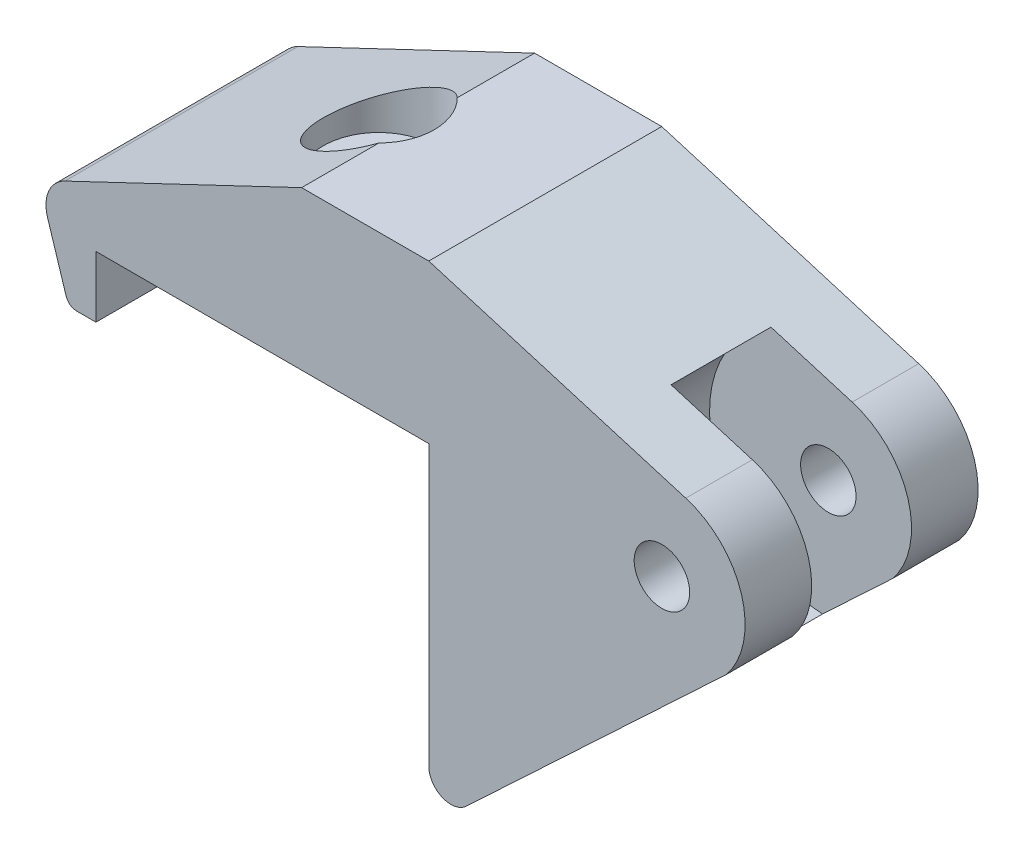
ISO-10303-21;
HEADER;
FILE_DESCRIPTION(('STEP AP214'),'2;1');
FILE_NAME('part.step','',(''),(''),'','','');
FILE_SCHEMA(('AUTOMOTIVE_DESIGN { 1 0 10303 214 1 1 1 1 }'));
ENDSEC;
DATA;
#1=APPLICATION_CONTEXT('core data for automotive mechanical design processes');
#2=APPLICATION_PROTOCOL_DEFINITION('international standard','automotive_design',2000,#1);
#3=PRODUCT_CONTEXT('',#1,'mechanical');
#4=PRODUCT('Part','Part','',(#3));
#5=PRODUCT_RELATED_PRODUCT_CATEGORY('part','',(#4));
#6=PRODUCT_DEFINITION_FORMATION('','',#4);
#7=PRODUCT_DEFINITION_CONTEXT('part definition',#1,'design');
#8=PRODUCT_DEFINITION('design','',#6,#7);
#9=PRODUCT_DEFINITION_SHAPE('','',#8);
#10=(LENGTH_UNIT() NAMED_UNIT(*) SI_UNIT(.MILLI.,.METRE.));
#11=(NAMED_UNIT(*) PLANE_ANGLE_UNIT() SI_UNIT($,.RADIAN.));
#12=(NAMED_UNIT(*) SI_UNIT($,.STERADIAN.) SOLID_ANGLE_UNIT());
#13=UNCERTAINTY_MEASURE_WITH_UNIT(LENGTH_MEASURE(1.E-05),#10,'distance_accuracy_value','');
#14=(GEOMETRIC_REPRESENTATION_CONTEXT(3) GLOBAL_UNCERTAINTY_ASSIGNED_CONTEXT((#13)) GLOBAL_UNIT_ASSIGNED_CONTEXT((#10,
#11,#12)) REPRESENTATION_CONTEXT('',''));
#15=CARTESIAN_POINT('',(0.,0.,0.));
#16=DIRECTION('',(0.,0.,1.));
#17=DIRECTION('',(1.,0.,0.));
#18=AXIS2_PLACEMENT_3D('',#15,#16,#17);
#19=CARTESIAN_POINT('',(-15.,36.251002769292,-4.5));
#20=DIRECTION('',(0.,-1.,0.));
#21=DIRECTION('',(1.,0.,0.));
#22=AXIS2_PLACEMENT_3D('',#19,#20,#21);
#23=CYLINDRICAL_SURFACE('',#22,5.);
#24=CARTESIAN_POINT('',(-15.,34.5660662940564,-4.5));
#25=DIRECTION('',(-0.429759506401997,0.902943390615996,0.));
#26=DIRECTION('',(-0.902943390615996,-0.429759506401997,0.));
#27=AXIS2_PLACEMENT_3D('',#24,#25,#26);
#28=ELLIPSE('',#27,5.53744570475116,5.);
#29=CARTESIAN_POINT('',(-11.4598752761535,36.251002769292,-8.03093711918105));
#30=VERTEX_POINT('',#29);
#31=CARTESIAN_POINT('',(-11.4598752761535,36.251002769292,-0.969062880818948));
#32=VERTEX_POINT('',#31);
#33=EDGE_CURVE('E254',#30,#32,#28,.T.);
#34=ORIENTED_EDGE('',*,*,#33,.T.);
#35=CARTESIAN_POINT('',(-15.,36.251002769292,-4.5));
#36=DIRECTION('',(0.,1.,0.));
#37=DIRECTION('',(0.,0.,1.));
#38=AXIS2_PLACEMENT_3D('',#35,#36,#37);
#39=CIRCLE('',#38,5.);
#40=EDGE_CURVE('E248',#32,#30,#39,.T.);
#41=ORIENTED_EDGE('',*,*,#40,.T.);
#42=EDGE_LOOP('',(#34,#41));
#43=FACE_BOUND('',#42,.T.);
#44=CARTESIAN_POINT('',(-15.,30.,-4.5));
#45=DIRECTION('',(0.,-1.,0.));
#46=DIRECTION('',(1.,0.,0.));
#47=AXIS2_PLACEMENT_3D('',#44,#45,#46);
#48=CIRCLE('',#47,5.);
#49=CARTESIAN_POINT('',(-10.,30.,-4.5));
#50=VERTEX_POINT('',#49);
#51=EDGE_CURVE('E12',#50,#50,#48,.F.);
#52=ORIENTED_EDGE('',*,*,#51,.F.);
#53=EDGE_LOOP('',(#52));
#54=FACE_BOUND('',#53,.T.);
#55=ADVANCED_FACE('F239',(#43,#54),#23,.F.);
#56=CARTESIAN_POINT('',(21.0164515512444,22.137322400844,-12.));
#57=DIRECTION('',(0.,0.,1.));
#58=DIRECTION('',(1.,0.,0.));
#59=AXIS2_PLACEMENT_3D('',#56,#57,#58);
#60=CYLINDRICAL_SURFACE('',#59,10.7077563901626);
#61=CARTESIAN_POINT('',(21.0164515512444,22.137322400844,-9.));
#62=DIRECTION('',(0.,0.,-1.));
#63=DIRECTION('',(-1.,0.,0.));
#64=AXIS2_PLACEMENT_3D('',#61,#62,#63);
#65=CIRCLE('',#64,10.7077563901626);
#66=CARTESIAN_POINT('',(15.8435034400864,31.512643982013,-9.));
#67=VERTEX_POINT('',#66);
#68=CARTESIAN_POINT('',(20.4941904225398,11.4423100013883,-9.));
#69=VERTEX_POINT('',#68);
#70=EDGE_CURVE('E262',#67,#69,#65,.F.);
#71=ORIENTED_EDGE('',*,*,#70,.F.);
#72=DIRECTION('',(0.,0.,1.));
#73=VECTOR('',#72,1.);
#74=CARTESIAN_POINT('',(15.8435034400864,31.512643982013,-12.));
#75=LINE('',#74,#73);
#76=CARTESIAN_POINT('',(15.8435034400864,31.512643982013,0.));
#77=VERTEX_POINT('',#76);
#78=EDGE_CURVE('E471',#67,#77,#75,.T.);
#79=ORIENTED_EDGE('',*,*,#78,.T.);
#80=CARTESIAN_POINT('',(21.0164515512444,22.137322400844,0.));
#81=DIRECTION('',(0.,0.,1.));
#82=DIRECTION('',(-1.,0.,0.));
#83=AXIS2_PLACEMENT_3D('',#80,#81,#82);
#84=CIRCLE('',#83,10.7077563901626);
#85=CARTESIAN_POINT('',(20.4941904225398,11.4423100013883,0.));
#86=VERTEX_POINT('',#85);
#87=EDGE_CURVE('E466',#77,#86,#84,.T.);
#88=ORIENTED_EDGE('',*,*,#87,.T.);
#89=DIRECTION('',(0.,0.,1.));
#90=VECTOR('',#89,1.);
#91=CARTESIAN_POINT('',(20.4941904225398,11.4423100013883,-12.));
#92=LINE('',#91,#90);
#93=EDGE_CURVE('E442',#69,#86,#92,.T.);
#94=ORIENTED_EDGE('',*,*,#93,.F.);
#95=EDGE_LOOP('',(#71,#79,#88,#94));
#96=FACE_BOUND('',#95,.T.);
#97=ADVANCED_FACE('F544',(#96),#60,.F.);
#98=CARTESIAN_POINT('',(-30.,16.4758973737552,-50.));
#99=DIRECTION('',(0.,-1.,0.));
#100=DIRECTION('',(0.,0.,-1.));
#101=AXIS2_PLACEMENT_3D('',#98,#99,#100);
#102=PLANE('',#101);
#103=DIRECTION('',(0.,0.,1.));
#104=VECTOR('',#103,1.);
#105=CARTESIAN_POINT('',(-30.,16.4758973737552,-50.));
#106=LINE('',#105,#104);
#107=CARTESIAN_POINT('',(-30.,16.4758973737552,-15.));
#108=VERTEX_POINT('',#107);
#109=CARTESIAN_POINT('',(-30.,16.4758973737552,6.));
#110=VERTEX_POINT('',#109);
#111=EDGE_CURVE('E397',#108,#110,#106,.T.);
#112=ORIENTED_EDGE('',*,*,#111,.T.);
#113=DIRECTION('',(1.,0.,0.));
#114=VECTOR('',#113,1.);
#115=CARTESIAN_POINT('',(-31.7352339741628,16.4758973737552,6.));
#116=LINE('',#115,#114);
#117=CARTESIAN_POINT('',(-31.7352339741628,16.4758973737552,6.));
#118=VERTEX_POINT('',#117);
#119=EDGE_CURVE('E513',#118,#110,#116,.T.);
#120=ORIENTED_EDGE('',*,*,#119,.F.);
#121=DIRECTION('',(0.,0.,1.));
#122=VECTOR('',#121,1.);
#123=CARTESIAN_POINT('',(-31.7352339741628,16.4758973737552,-50.));
#124=LINE('',#123,#122);
#125=CARTESIAN_POINT('',(-31.7352339741628,16.4758973737552,-15.));
#126=VERTEX_POINT('',#125);
#127=EDGE_CURVE('E423',#118,#126,#124,.F.);
#128=ORIENTED_EDGE('',*,*,#127,.T.);
#129=DIRECTION('',(-1.,0.,0.));
#130=VECTOR('',#129,1.);
#131=CARTESIAN_POINT('',(-30.,16.4758973737552,-15.));
#132=LINE('',#131,#130);
#133=EDGE_CURVE('E448',#108,#126,#132,.T.);
#134=ORIENTED_EDGE('',*,*,#133,.F.);
#135=EDGE_LOOP('',(#112,#120,#128,#134));
#136=FACE_BOUND('',#135,.T.);
#137=ADVANCED_FACE('F546',(#136),#102,.T.);
#138=CARTESIAN_POINT('',(-32.4681212818034,16.4758973737552,-50.));
#139=DIRECTION('',(-0.953582665134141,-0.301131367937098,0.));
#140=DIRECTION('',(0.301131367937098,-0.953582665134142,0.));
#141=AXIS2_PLACEMENT_3D('',#138,#139,#140);
#142=PLANE('',#141);
#143=DIRECTION('',(0.,0.,1.));
#144=VECTOR('',#143,1.);
#145=CARTESIAN_POINT('',(-32.6888166392969,17.1747660058181,-50.));
#146=LINE('',#145,#144);
#147=CARTESIAN_POINT('',(-32.6888166392969,17.1747660058181,-15.));
#148=VERTEX_POINT('',#147);
#149=CARTESIAN_POINT('',(-32.6888166392969,17.1747660058181,6.));
#150=VERTEX_POINT('',#149);
#151=EDGE_CURVE('E420',#148,#150,#146,.T.);
#152=ORIENTED_EDGE('',*,*,#151,.T.);
#153=DIRECTION('',(0.301131367937098,-0.953582665134141,0.));
#154=VECTOR('',#153,1.);
#155=CARTESIAN_POINT('',(-34.3656205008556,22.4846449007538,6.));
#156=LINE('',#155,#154);
#157=CARTESIAN_POINT('',(-34.3656205008556,22.4846449007538,6.));
#158=VERTEX_POINT('',#157);
#159=EDGE_CURVE('E506',#158,#150,#156,.T.);
#160=ORIENTED_EDGE('',*,*,#159,.F.);
#161=DIRECTION('',(0.,0.,1.));
#162=VECTOR('',#161,1.);
#163=CARTESIAN_POINT('',(-34.3656205008556,22.4846449007538,-50.));
#164=LINE('',#163,#162);
#165=CARTESIAN_POINT('',(-34.3656205008556,22.4846449007538,-15.));
#166=VERTEX_POINT('',#165);
#167=EDGE_CURVE('E417',#158,#166,#164,.F.);
#168=ORIENTED_EDGE('',*,*,#167,.T.);
#169=DIRECTION('',(-0.301131367937098,0.953582665134141,0.));
#170=VECTOR('',#169,1.);
#171=CARTESIAN_POINT('',(-32.6888166392969,17.1747660058181,-15.));
#172=LINE('',#171,#170);
#173=EDGE_CURVE('E616',#148,#166,#172,.T.);
#174=ORIENTED_EDGE('',*,*,#173,.F.);
#175=EDGE_LOOP('',(#152,#160,#168,#174));
#176=FACE_BOUND('',#175,.T.);
#177=ADVANCED_FACE('F552',(#176),#142,.T.);
#178=CARTESIAN_POINT('',(0.,22.,6.));
#179=DIRECTION('',(0.,1.,0.));
#180=DIRECTION('',(-1.,0.,0.));
#181=AXIS2_PLACEMENT_3D('',#178,#179,#180);
#182=PLANE('',#181);
#183=DIRECTION('',(0.,0.,-1.));
#184=VECTOR('',#183,1.);
#185=CARTESIAN_POINT('',(0.,22.,6.));
#186=LINE('',#185,#184);
#187=CARTESIAN_POINT('',(0.,22.,6.));
#188=VERTEX_POINT('',#187);
#189=CARTESIAN_POINT('',(0.,22.,-15.));
#190=VERTEX_POINT('',#189);
#191=EDGE_CURVE('E400',#188,#190,#186,.T.);
#192=ORIENTED_EDGE('',*,*,#191,.F.);
#193=DIRECTION('',(1.,0.,0.));
#194=VECTOR('',#193,1.);
#195=CARTESIAN_POINT('',(-30.,22.,6.));
#196=LINE('',#195,#194);
#197=CARTESIAN_POINT('',(-30.,22.,6.));
#198=VERTEX_POINT('',#197);
#199=EDGE_CURVE('E477',#198,#188,#196,.T.);
#200=ORIENTED_EDGE('',*,*,#199,.F.);
#201=DIRECTION('',(0.,0.,-1.));
#202=VECTOR('',#201,1.);
#203=CARTESIAN_POINT('',(-30.,22.,6.));
#204=LINE('',#203,#202);
#205=CARTESIAN_POINT('',(-30.,22.,-15.));
#206=VERTEX_POINT('',#205);
#207=EDGE_CURVE('E403',#198,#206,#204,.T.);
#208=ORIENTED_EDGE('',*,*,#207,.T.);
#209=DIRECTION('',(-1.,0.,0.));
#210=VECTOR('',#209,1.);
#211=CARTESIAN_POINT('',(0.,22.,-15.));
#212=LINE('',#211,#210);
#213=EDGE_CURVE('E644',#190,#206,#212,.T.);
#214=ORIENTED_EDGE('',*,*,#213,.F.);
#215=EDGE_LOOP('',(#192,#200,#208,#214));
#216=FACE_BOUND('',#215,.T.);
#217=CARTESIAN_POINT('',(-15.,22.,-4.5));
#218=DIRECTION('',(0.,-1.,0.));
#219=DIRECTION('',(1.,0.,0.));
#220=AXIS2_PLACEMENT_3D('',#217,#218,#219);
#221=CIRCLE('',#220,2.58274648517355);
#222=CARTESIAN_POINT('',(-12.4172535148265,22.,-4.5));
#223=VERTEX_POINT('',#222);
#224=EDGE_CURVE('E719',#223,#223,#221,.T.);
#225=ORIENTED_EDGE('',*,*,#224,.F.);
#226=EDGE_LOOP('',(#225));
#227=FACE_BOUND('',#226,.T.);
#228=ADVANCED_FACE('F584',(#216,#227),#182,.F.);
#229=CARTESIAN_POINT('',(-30.,22.,-50.));
#230=DIRECTION('',(1.,0.,0.));
#231=DIRECTION('',(0.,0.,-1.));
#232=AXIS2_PLACEMENT_3D('',#229,#230,#231);
#233=PLANE('',#232);
#234=DIRECTION('',(0.,-1.,0.));
#235=VECTOR('',#234,1.);
#236=CARTESIAN_POINT('',(-30.,22.,-15.));
#237=LINE('',#236,#235);
#238=EDGE_CURVE('E462',#206,#108,#237,.T.);
#239=ORIENTED_EDGE('',*,*,#238,.F.);
#240=ORIENTED_EDGE('',*,*,#207,.F.);
#241=DIRECTION('',(0.,1.,0.));
#242=VECTOR('',#241,1.);
#243=CARTESIAN_POINT('',(-30.,16.4758973737552,6.));
#244=LINE('',#243,#242);
#245=EDGE_CURVE('E474',#110,#198,#244,.T.);
#246=ORIENTED_EDGE('',*,*,#245,.F.);
#247=ORIENTED_EDGE('',*,*,#111,.F.);
#248=EDGE_LOOP('',(#239,#240,#246,#247));
#249=FACE_BOUND('',#248,.T.);
#250=ADVANCED_FACE('F582',(#249),#233,.T.);
#251=CARTESIAN_POINT('',(-35.1519436968129,24.9746683546187,-50.));
#252=DIRECTION('',(-0.429759506401997,0.902943390615996,0.));
#253=DIRECTION('',(-0.902943390615996,-0.429759506401997,0.));
#254=AXIS2_PLACEMENT_3D('',#251,#252,#253);
#255=PLANE('',#254);
#256=ORIENTED_EDGE('',*,*,#33,.F.);
#257=DIRECTION('',(0.,0.,1.));
#258=VECTOR('',#257,1.);
#259=CARTESIAN_POINT('',(-11.4598752761535,36.251002769292,-20.));
#260=LINE('',#259,#258);
#261=CARTESIAN_POINT('',(-11.4598752761535,36.251002769292,-15.));
#262=VERTEX_POINT('',#261);
#263=EDGE_CURVE('E371',#262,#30,#260,.T.);
#264=ORIENTED_EDGE('',*,*,#263,.F.);
#265=DIRECTION('',(0.902943390615997,0.429759506401997,0.));
#266=VECTOR('',#265,1.);
#267=CARTESIAN_POINT('',(-32.7941510246591,26.0968691764131,-15.));
#268=LINE('',#267,#266);
#269=CARTESIAN_POINT('',(-32.7941510246591,26.0968691764131,-15.));
#270=VERTEX_POINT('',#269);
#271=EDGE_CURVE('E615',#270,#262,#268,.T.);
#272=ORIENTED_EDGE('',*,*,#271,.F.);
#273=DIRECTION('',(0.,0.,1.));
#274=VECTOR('',#273,1.);
#275=CARTESIAN_POINT('',(-32.7941510246591,26.0968691764131,-50.));
#276=LINE('',#275,#274);
#277=CARTESIAN_POINT('',(-32.7941510246591,26.0968691764131,6.));
#278=VERTEX_POINT('',#277);
#279=EDGE_CURVE('E413',#270,#278,#276,.T.);
#280=ORIENTED_EDGE('',*,*,#279,.T.);
#281=DIRECTION('',(-0.902943390615997,-0.429759506401997,0.));
#282=VECTOR('',#281,1.);
#283=CARTESIAN_POINT('',(-11.4598752761535,36.251002769292,6.));
#284=LINE('',#283,#282);
#285=CARTESIAN_POINT('',(-11.4598752761535,36.251002769292,6.));
#286=VERTEX_POINT('',#285);
#287=EDGE_CURVE('E500',#286,#278,#284,.T.);
#288=ORIENTED_EDGE('',*,*,#287,.F.);
#289=EDGE_CURVE('E374',#32,#286,#260,.T.);
#290=ORIENTED_EDGE('',*,*,#289,.F.);
#291=EDGE_LOOP('',(#256,#264,#272,#280,#288,#290));
#292=FACE_BOUND('',#291,.T.);
#293=ADVANCED_FACE('F369',(#292),#255,.T.);
#294=CARTESIAN_POINT('',(-31.5048725054531,23.3880390045651,-50.));
#295=DIRECTION('',(0.,0.,1.));
#296=DIRECTION('',(1.,0.,0.));
#297=AXIS2_PLACEMENT_3D('',#294,#295,#296);
#298=CYLINDRICAL_SURFACE('',#297,3.);
#299=CARTESIAN_POINT('',(-31.5048725054531,23.3880390045651,-15.));
#300=DIRECTION('',(0.,0.,-1.));
#301=DIRECTION('',(-1.,0.,0.));
#302=AXIS2_PLACEMENT_3D('',#299,#300,#301);
#303=CIRCLE('',#302,3.);
#304=EDGE_CURVE('E610',#166,#270,#303,.T.);
#305=ORIENTED_EDGE('',*,*,#304,.F.);
#306=ORIENTED_EDGE('',*,*,#167,.F.);
#307=CARTESIAN_POINT('',(-31.5048725054531,23.3880390045651,6.));
#308=DIRECTION('',(0.,0.,1.));
#309=DIRECTION('',(1.,0.,0.));
#310=AXIS2_PLACEMENT_3D('',#307,#308,#309);
#311=CIRCLE('',#310,3.);
#312=EDGE_CURVE('E503',#278,#158,#311,.T.);
#313=ORIENTED_EDGE('',*,*,#312,.F.);
#314=ORIENTED_EDGE('',*,*,#279,.F.);
#315=EDGE_LOOP('',(#305,#306,#313,#314));
#316=FACE_BOUND('',#315,.T.);
#317=ADVANCED_FACE('F592',(#316),#298,.T.);
#318=CARTESIAN_POINT('',(-31.7352339741628,17.4758973737552,-50.));
#319=DIRECTION('',(0.,0.,1.));
#320=DIRECTION('',(1.,0.,0.));
#321=AXIS2_PLACEMENT_3D('',#318,#319,#320);
#322=CYLINDRICAL_SURFACE('',#321,1.);
#323=CARTESIAN_POINT('',(-31.7352339741628,17.4758973737552,-15.));
#324=DIRECTION('',(0.,0.,-1.));
#325=DIRECTION('',(-1.,0.,0.));
#326=AXIS2_PLACEMENT_3D('',#323,#324,#325);
#327=CIRCLE('',#326,1.);
#328=EDGE_CURVE('E454',#126,#148,#327,.T.);
#329=ORIENTED_EDGE('',*,*,#328,.F.);
#330=ORIENTED_EDGE('',*,*,#127,.F.);
#331=CARTESIAN_POINT('',(-31.7352339741628,17.4758973737552,6.));
#332=DIRECTION('',(0.,0.,1.));
#333=DIRECTION('',(1.,0.,0.));
#334=AXIS2_PLACEMENT_3D('',#331,#332,#333);
#335=CIRCLE('',#334,1.);
#336=EDGE_CURVE('E510',#150,#118,#335,.T.);
#337=ORIENTED_EDGE('',*,*,#336,.F.);
#338=ORIENTED_EDGE('',*,*,#151,.F.);
#339=EDGE_LOOP('',(#329,#330,#337,#338));
#340=FACE_BOUND('',#339,.T.);
#341=ADVANCED_FACE('F241',(#340),#322,.T.);
#342=CARTESIAN_POINT('',(9.95157109656071,33.2747598864639,12.));
#343=DIRECTION('',(0.286532687163959,0.958070466712444,0.));
#344=DIRECTION('',(-0.958070466712444,0.286532687163959,0.));
#345=AXIS2_PLACEMENT_3D('',#342,#343,#344);
#346=PLANE('',#345);
#347=DIRECTION('',(0.958070466712444,-0.286532687163959,0.));
#348=VECTOR('',#347,1.);
#349=CARTESIAN_POINT('',(0.,36.251002769292,-15.));
#350=LINE('',#349,#348);
#351=CARTESIAN_POINT('',(0.,36.251002769292,-15.));
#352=VERTEX_POINT('',#351);
#353=CARTESIAN_POINT('',(23.1654467049741,29.3228509011873,-15.));
#354=VERTEX_POINT('',#353);
#355=EDGE_CURVE('E626',#352,#354,#350,.T.);
#356=ORIENTED_EDGE('',*,*,#355,.F.);
#357=DIRECTION('',(0.,0.,-1.));
#358=VECTOR('',#357,1.);
#359=CARTESIAN_POINT('',(0.,36.251002769292,12.));
#360=LINE('',#359,#358);
#361=CARTESIAN_POINT('',(0.,36.251002769292,6.));
#362=VERTEX_POINT('',#361);
#363=EDGE_CURVE('E396',#362,#352,#360,.T.);
#364=ORIENTED_EDGE('',*,*,#363,.F.);
#365=DIRECTION('',(-0.958070466712444,0.286532687163959,0.));
#366=VECTOR('',#365,1.);
#367=CARTESIAN_POINT('',(23.1654467049741,29.3228509011873,6.));
#368=LINE('',#367,#366);
#369=CARTESIAN_POINT('',(23.1654467049741,29.3228509011873,6.));
#370=VERTEX_POINT('',#369);
#371=EDGE_CURVE('E493',#370,#362,#368,.T.);
#372=ORIENTED_EDGE('',*,*,#371,.F.);
#373=DIRECTION('',(0.,0.,-1.));
#374=VECTOR('',#373,1.);
#375=CARTESIAN_POINT('',(23.1654467049741,29.3228509011873,12.));
#376=LINE('',#375,#374);
#377=CARTESIAN_POINT('',(23.1654467049741,29.3228509011873,0.));
#378=VERTEX_POINT('',#377);
#379=EDGE_CURVE('E383',#370,#378,#376,.T.);
#380=ORIENTED_EDGE('',*,*,#379,.T.);
#381=DIRECTION('',(-0.958070466712444,0.286532687163959,0.));
#382=VECTOR('',#381,1.);
#383=CARTESIAN_POINT('',(9.95157109656071,33.2747598864639,0.));
#384=LINE('',#383,#382);
#385=EDGE_CURVE('E389',#378,#77,#384,.T.);
#386=ORIENTED_EDGE('',*,*,#385,.T.);
#387=ORIENTED_EDGE('',*,*,#78,.F.);
#388=DIRECTION('',(0.958070466712444,-0.286532687163959,0.));
#389=VECTOR('',#388,1.);
#390=CARTESIAN_POINT('',(0.,36.251002769292,-9.));
#391=LINE('',#390,#389);
#392=CARTESIAN_POINT('',(23.1654467049741,29.3228509011873,-9.));
#393=VERTEX_POINT('',#392);
#394=EDGE_CURVE('E438',#67,#393,#391,.T.);
#395=ORIENTED_EDGE('',*,*,#394,.T.);
#396=DIRECTION('',(0.,0.,1.));
#397=VECTOR('',#396,1.);
#398=CARTESIAN_POINT('',(23.1654467049741,29.3228509011873,-15.));
#399=LINE('',#398,#397);
#400=EDGE_CURVE('E461',#354,#393,#399,.T.);
#401=ORIENTED_EDGE('',*,*,#400,.F.);
#402=EDGE_LOOP('',(#356,#364,#372,#380,#386,#387,#395,#401));
#403=FACE_BOUND('',#402,.T.);
#404=ADVANCED_FACE('F538',(#403),#346,.T.);
#405=CARTESIAN_POINT('',(0.,0.,0.));
#406=DIRECTION('',(0.,0.,1.));
#407=DIRECTION('',(1.,0.,0.));
#408=AXIS2_PLACEMENT_3D('',#405,#406,#407);
#409=PLANE('',#408);
#410=CARTESIAN_POINT('',(21.0164515512444,22.137322400844,0.));
#411=DIRECTION('',(0.,0.,1.));
#412=DIRECTION('',(1.,0.,0.));
#413=AXIS2_PLACEMENT_3D('',#410,#411,#412);
#414=CIRCLE('',#413,2.5);
#415=CARTESIAN_POINT('',(23.5164515512444,22.137322400844,0.));
#416=VERTEX_POINT('',#415);
#417=EDGE_CURVE('E521',#416,#416,#414,.F.);
#418=ORIENTED_EDGE('',*,*,#417,.F.);
#419=EDGE_LOOP('',(#418));
#420=FACE_BOUND('',#419,.T.);
#421=ORIENTED_EDGE('',*,*,#87,.F.);
#422=ORIENTED_EDGE('',*,*,#385,.F.);
#423=CARTESIAN_POINT('',(21.0164515512444,22.137322400844,0.));
#424=DIRECTION('',(0.,0.,1.));
#425=DIRECTION('',(1.,0.,0.));
#426=AXIS2_PLACEMENT_3D('',#423,#424,#425);
#427=CIRCLE('',#426,7.50000000000001);
#428=CARTESIAN_POINT('',(26.7905466706926,17.3509014465646,0.));
#429=VERTEX_POINT('',#428);
#430=EDGE_CURVE('E527',#429,#378,#427,.T.);
#431=ORIENTED_EDGE('',*,*,#430,.F.);
#432=DIRECTION('',(0.72920441439023,0.684295931621547,0.));
#433=VECTOR('',#432,1.);
#434=CARTESIAN_POINT('',(3.88701176711011,-4.14210578842233,0.));
#435=LINE('',#434,#433);
#436=EDGE_CURVE('E525',#86,#429,#435,.T.);
#437=ORIENTED_EDGE('',*,*,#436,.F.);
#438=EDGE_LOOP('',(#421,#422,#431,#437));
#439=FACE_BOUND('',#438,.T.);
#440=ADVANCED_FACE('F542',(#420,#439),#409,.F.);
#441=CARTESIAN_POINT('',(2.,-3.17157287525383,6.));
#442=DIRECTION('',(0.,0.,-1.));
#443=DIRECTION('',(-1.,0.,0.));
#444=AXIS2_PLACEMENT_3D('',#441,#442,#443);
#445=CYLINDRICAL_SURFACE('',#444,2.);
#446=CARTESIAN_POINT('',(2.,-3.17157287525383,-15.));
#447=DIRECTION('',(0.,0.,-1.));
#448=DIRECTION('',(-1.,0.,0.));
#449=AXIS2_PLACEMENT_3D('',#446,#447,#448);
#450=CIRCLE('',#449,2.);
#451=CARTESIAN_POINT('',(3.41421356237313,-4.58578643762689,-15.));
#452=VERTEX_POINT('',#451);
#453=CARTESIAN_POINT('',(0.,-3.17157287525383,-15.));
#454=VERTEX_POINT('',#453);
#455=EDGE_CURVE('E636',#452,#454,#450,.T.);
#456=ORIENTED_EDGE('',*,*,#455,.F.);
#457=DIRECTION('',(0.,0.,-1.));
#458=VECTOR('',#457,1.);
#459=CARTESIAN_POINT('',(3.41421356237313,-4.58578643762689,6.));
#460=LINE('',#459,#458);
#461=CARTESIAN_POINT('',(3.41421356237313,-4.58578643762689,6.));
#462=VERTEX_POINT('',#461);
#463=EDGE_CURVE('E407',#462,#452,#460,.T.);
#464=ORIENTED_EDGE('',*,*,#463,.F.);
#465=CARTESIAN_POINT('',(2.,-3.17157287525383,6.));
#466=DIRECTION('',(0.,0.,1.));
#467=DIRECTION('',(1.,0.,0.));
#468=AXIS2_PLACEMENT_3D('',#465,#466,#467);
#469=CIRCLE('',#468,2.);
#470=CARTESIAN_POINT('',(0.,-3.17157287525383,6.));
#471=VERTEX_POINT('',#470);
#472=EDGE_CURVE('E483',#471,#462,#469,.T.);
#473=ORIENTED_EDGE('',*,*,#472,.F.);
#474=DIRECTION('',(0.,0.,-1.));
#475=VECTOR('',#474,1.);
#476=CARTESIAN_POINT('',(0.,-3.17157287525383,6.));
#477=LINE('',#476,#475);
#478=EDGE_CURVE('E410',#471,#454,#477,.T.);
#479=ORIENTED_EDGE('',*,*,#478,.T.);
#480=EDGE_LOOP('',(#456,#464,#473,#479));
#481=FACE_BOUND('',#480,.T.);
#482=ADVANCED_FACE('F567',(#481),#445,.T.);
#483=CARTESIAN_POINT('',(0.,0.,6.));
#484=DIRECTION('',(1.,0.,0.));
#485=DIRECTION('',(0.,1.,0.));
#486=AXIS2_PLACEMENT_3D('',#483,#484,#485);
#487=PLANE('',#486);
#488=ORIENTED_EDGE('',*,*,#191,.T.);
#489=DIRECTION('',(0.,1.,0.));
#490=VECTOR('',#489,1.);
#491=CARTESIAN_POINT('',(0.,-3.17157287525383,-15.));
#492=LINE('',#491,#490);
#493=EDGE_CURVE('E640',#454,#190,#492,.T.);
#494=ORIENTED_EDGE('',*,*,#493,.F.);
#495=ORIENTED_EDGE('',*,*,#478,.F.);
#496=DIRECTION('',(0.,-1.,0.));
#497=VECTOR('',#496,1.);
#498=CARTESIAN_POINT('',(0.,22.,6.));
#499=LINE('',#498,#497);
#500=EDGE_CURVE('E480',#188,#471,#499,.T.);
#501=ORIENTED_EDGE('',*,*,#500,.F.);
#502=EDGE_LOOP('',(#488,#494,#495,#501));
#503=FACE_BOUND('',#502,.T.);
#504=ADVANCED_FACE('F579',(#503),#487,.F.);
#505=CARTESIAN_POINT('',(0.,36.251002769292,12.));
#506=DIRECTION('',(0.,1.,0.));
#507=DIRECTION('',(0.,0.,1.));
#508=AXIS2_PLACEMENT_3D('',#505,#506,#507);
#509=PLANE('',#508);
#510=ORIENTED_EDGE('',*,*,#40,.F.);
#511=ORIENTED_EDGE('',*,*,#289,.T.);
#512=DIRECTION('',(-1.,0.,0.));
#513=VECTOR('',#512,1.);
#514=CARTESIAN_POINT('',(0.,36.251002769292,6.));
#515=LINE('',#514,#513);
#516=EDGE_CURVE('E496',#362,#286,#515,.T.);
#517=ORIENTED_EDGE('',*,*,#516,.F.);
#518=ORIENTED_EDGE('',*,*,#363,.T.);
#519=DIRECTION('',(1.,0.,0.));
#520=VECTOR('',#519,1.);
#521=CARTESIAN_POINT('',(-11.4598752761535,36.251002769292,-15.));
#522=LINE('',#521,#520);
#523=EDGE_CURVE('E381',#262,#352,#522,.T.);
#524=ORIENTED_EDGE('',*,*,#523,.F.);
#525=ORIENTED_EDGE('',*,*,#263,.T.);
#526=EDGE_LOOP('',(#510,#511,#517,#518,#524,#525));
#527=FACE_BOUND('',#526,.T.);
#528=ADVANCED_FACE('F379',(#527),#509,.T.);
#529=CARTESIAN_POINT('',(3.88701176711011,-4.14210578842233,12.));
#530=DIRECTION('',(-0.684295931621547,0.72920441439023,0.));
#531=DIRECTION('',(-0.72920441439023,-0.684295931621547,0.));
#532=AXIS2_PLACEMENT_3D('',#529,#530,#531);
#533=PLANE('',#532);
#534=DIRECTION('',(-0.72920441439023,-0.684295931621547,0.));
#535=VECTOR('',#534,1.);
#536=CARTESIAN_POINT('',(26.7905466706926,17.3509014465646,-9.));
#537=LINE('',#536,#535);
#538=CARTESIAN_POINT('',(26.7905466706926,17.3509014465646,-9.));
#539=VERTEX_POINT('',#538);
#540=EDGE_CURVE('E437',#539,#69,#537,.T.);
#541=ORIENTED_EDGE('',*,*,#540,.T.);
#542=ORIENTED_EDGE('',*,*,#93,.T.);
#543=ORIENTED_EDGE('',*,*,#436,.T.);
#544=DIRECTION('',(0.,0.,-1.));
#545=VECTOR('',#544,1.);
#546=CARTESIAN_POINT('',(26.7905466706926,17.3509014465646,12.));
#547=LINE('',#546,#545);
#548=CARTESIAN_POINT('',(26.7905466706926,17.3509014465646,6.));
#549=VERTEX_POINT('',#548);
#550=EDGE_CURVE('E387',#549,#429,#547,.T.);
#551=ORIENTED_EDGE('',*,*,#550,.F.);
#552=DIRECTION('',(0.72920441439023,0.684295931621547,0.));
#553=VECTOR('',#552,1.);
#554=CARTESIAN_POINT('',(3.41421356237313,-4.58578643762689,6.));
#555=LINE('',#554,#553);
#556=EDGE_CURVE('E487',#462,#549,#555,.T.);
#557=ORIENTED_EDGE('',*,*,#556,.F.);
#558=ORIENTED_EDGE('',*,*,#463,.T.);
#559=DIRECTION('',(-0.72920441439023,-0.684295931621547,0.));
#560=VECTOR('',#559,1.);
#561=CARTESIAN_POINT('',(26.7905466706926,17.3509014465646,-15.));
#562=LINE('',#561,#560);
#563=CARTESIAN_POINT('',(26.7905466706926,17.3509014465646,-15.));
#564=VERTEX_POINT('',#563);
#565=EDGE_CURVE('E632',#564,#452,#562,.T.);
#566=ORIENTED_EDGE('',*,*,#565,.F.);
#567=DIRECTION('',(0.,0.,1.));
#568=VECTOR('',#567,1.);
#569=CARTESIAN_POINT('',(26.7905466706926,17.3509014465646,-15.));
#570=LINE('',#569,#568);
#571=EDGE_CURVE('E446',#564,#539,#570,.T.);
#572=ORIENTED_EDGE('',*,*,#571,.T.);
#573=EDGE_LOOP('',(#541,#542,#543,#551,#557,#558,#566,#572));
#574=FACE_BOUND('',#573,.T.);
#575=ADVANCED_FACE('F441',(#574),#533,.F.);
#576=CARTESIAN_POINT('',(21.0164515512444,22.137322400844,12.));
#577=DIRECTION('',(0.,0.,-1.));
#578=DIRECTION('',(-1.,0.,0.));
#579=AXIS2_PLACEMENT_3D('',#576,#577,#578);
#580=CYLINDRICAL_SURFACE('',#579,2.5);
#581=ORIENTED_EDGE('',*,*,#417,.T.);
#582=EDGE_LOOP('',(#581));
#583=FACE_BOUND('',#582,.T.);
#584=CARTESIAN_POINT('',(21.0164515512444,22.137322400844,6.));
#585=DIRECTION('',(0.,0.,1.));
#586=DIRECTION('',(1.,0.,0.));
#587=AXIS2_PLACEMENT_3D('',#584,#585,#586);
#588=CIRCLE('',#587,2.5);
#589=CARTESIAN_POINT('',(23.5164515512444,22.137322400844,6.));
#590=VERTEX_POINT('',#589);
#591=EDGE_CURVE('E517',#590,#590,#588,.T.);
#592=ORIENTED_EDGE('',*,*,#591,.T.);
#593=EDGE_LOOP('',(#592));
#594=FACE_BOUND('',#593,.T.);
#595=ADVANCED_FACE('F569',(#583,#594),#580,.F.);
#596=CARTESIAN_POINT('',(21.0164515512444,22.137322400844,12.));
#597=DIRECTION('',(0.,0.,-1.));
#598=DIRECTION('',(-1.,0.,0.));
#599=AXIS2_PLACEMENT_3D('',#596,#597,#598);
#600=CYLINDRICAL_SURFACE('',#599,7.50000000000001);
#601=CARTESIAN_POINT('',(21.0164515512444,22.137322400844,6.));
#602=DIRECTION('',(0.,0.,1.));
#603=DIRECTION('',(1.,0.,0.));
#604=AXIS2_PLACEMENT_3D('',#601,#602,#603);
#605=CIRCLE('',#604,7.5);
#606=EDGE_CURVE('E490',#549,#370,#605,.T.);
#607=ORIENTED_EDGE('',*,*,#606,.F.);
#608=ORIENTED_EDGE('',*,*,#550,.T.);
#609=ORIENTED_EDGE('',*,*,#430,.T.);
#610=ORIENTED_EDGE('',*,*,#379,.F.);
#611=EDGE_LOOP('',(#607,#608,#609,#610));
#612=FACE_BOUND('',#611,.T.);
#613=ADVANCED_FACE('F563',(#612),#600,.T.);
#614=CARTESIAN_POINT('',(2.,-3.17157287525383,6.));
#615=DIRECTION('',(0.,0.,1.));
#616=DIRECTION('',(1.,0.,0.));
#617=AXIS2_PLACEMENT_3D('',#614,#615,#616);
#618=PLANE('',#617);
#619=ORIENTED_EDGE('',*,*,#516,.T.);
#620=ORIENTED_EDGE('',*,*,#287,.T.);
#621=ORIENTED_EDGE('',*,*,#312,.T.);
#622=ORIENTED_EDGE('',*,*,#159,.T.);
#623=ORIENTED_EDGE('',*,*,#336,.T.);
#624=ORIENTED_EDGE('',*,*,#119,.T.);
#625=ORIENTED_EDGE('',*,*,#245,.T.);
#626=ORIENTED_EDGE('',*,*,#199,.T.);
#627=ORIENTED_EDGE('',*,*,#500,.T.);
#628=ORIENTED_EDGE('',*,*,#472,.T.);
#629=ORIENTED_EDGE('',*,*,#556,.T.);
#630=ORIENTED_EDGE('',*,*,#606,.T.);
#631=ORIENTED_EDGE('',*,*,#371,.T.);
#632=EDGE_LOOP('',(#619,#620,#621,#622,#623,#624,#625,#626,#627,#628,#629,#630,#631));
#633=FACE_BOUND('',#632,.T.);
#634=ORIENTED_EDGE('',*,*,#591,.F.);
#635=EDGE_LOOP('',(#634));
#636=FACE_BOUND('',#635,.T.);
#637=ADVANCED_FACE('F560',(#633,#636),#618,.T.);
#638=CARTESIAN_POINT('',(-31.7352339741628,17.4758973737552,-9.));
#639=DIRECTION('',(0.,0.,-1.));
#640=DIRECTION('',(-1.,0.,0.));
#641=AXIS2_PLACEMENT_3D('',#638,#639,#640);
#642=PLANE('',#641);
#643=CARTESIAN_POINT('',(21.0164515512444,22.137322400844,-9.));
#644=DIRECTION('',(0.,0.,-1.));
#645=DIRECTION('',(-1.,0.,0.));
#646=AXIS2_PLACEMENT_3D('',#643,#644,#645);
#647=CIRCLE('',#646,2.5);
#648=CARTESIAN_POINT('',(18.5164515512444,22.137322400844,-9.));
#649=VERTEX_POINT('',#648);
#650=EDGE_CURVE('E376',#649,#649,#647,.T.);
#651=ORIENTED_EDGE('',*,*,#650,.T.);
#652=EDGE_LOOP('',(#651));
#653=FACE_BOUND('',#652,.T.);
#654=ORIENTED_EDGE('',*,*,#394,.F.);
#655=ORIENTED_EDGE('',*,*,#70,.T.);
#656=ORIENTED_EDGE('',*,*,#540,.F.);
#657=CARTESIAN_POINT('',(21.0164515512444,22.137322400844,-9.));
#658=DIRECTION('',(0.,0.,-1.));
#659=DIRECTION('',(-1.,0.,0.));
#660=AXIS2_PLACEMENT_3D('',#657,#658,#659);
#661=CIRCLE('',#660,7.5);
#662=EDGE_CURVE('E449',#393,#539,#661,.T.);
#663=ORIENTED_EDGE('',*,*,#662,.F.);
#664=EDGE_LOOP('',(#654,#655,#656,#663));
#665=FACE_BOUND('',#664,.T.);
#666=ADVANCED_FACE('F435',(#653,#665),#642,.F.);
#667=CARTESIAN_POINT('',(-31.7352339741628,17.4758973737552,-15.));
#668=DIRECTION('',(0.,0.,-1.));
#669=DIRECTION('',(-1.,0.,0.));
#670=AXIS2_PLACEMENT_3D('',#667,#668,#669);
#671=PLANE('',#670);
#672=ORIENTED_EDGE('',*,*,#213,.T.);
#673=ORIENTED_EDGE('',*,*,#238,.T.);
#674=ORIENTED_EDGE('',*,*,#133,.T.);
#675=ORIENTED_EDGE('',*,*,#328,.T.);
#676=ORIENTED_EDGE('',*,*,#173,.T.);
#677=ORIENTED_EDGE('',*,*,#304,.T.);
#678=ORIENTED_EDGE('',*,*,#271,.T.);
#679=ORIENTED_EDGE('',*,*,#523,.T.);
#680=ORIENTED_EDGE('',*,*,#355,.T.);
#681=CARTESIAN_POINT('',(21.0164515512444,22.137322400844,-15.));
#682=DIRECTION('',(0.,0.,-1.));
#683=DIRECTION('',(-1.,0.,0.));
#684=AXIS2_PLACEMENT_3D('',#681,#682,#683);
#685=CIRCLE('',#684,7.5);
#686=EDGE_CURVE('E629',#354,#564,#685,.T.);
#687=ORIENTED_EDGE('',*,*,#686,.T.);
#688=ORIENTED_EDGE('',*,*,#565,.T.);
#689=ORIENTED_EDGE('',*,*,#455,.T.);
#690=ORIENTED_EDGE('',*,*,#493,.T.);
#691=EDGE_LOOP('',(#672,#673,#674,#675,#676,#677,#678,#679,#680,#687,#688,#689,#690));
#692=FACE_BOUND('',#691,.T.);
#693=CARTESIAN_POINT('',(21.0164515512444,22.137322400844,-15.));
#694=DIRECTION('',(0.,0.,-1.));
#695=DIRECTION('',(-1.,0.,0.));
#696=AXIS2_PLACEMENT_3D('',#693,#694,#695);
#697=CIRCLE('',#696,2.5);
#698=CARTESIAN_POINT('',(18.5164515512444,22.137322400844,-15.));
#699=VERTEX_POINT('',#698);
#700=EDGE_CURVE('E650',#699,#699,#697,.T.);
#701=ORIENTED_EDGE('',*,*,#700,.F.);
#702=EDGE_LOOP('',(#701));
#703=FACE_BOUND('',#702,.T.);
#704=ADVANCED_FACE('F665',(#692,#703),#671,.T.);
#705=CARTESIAN_POINT('',(21.0164515512444,22.137322400844,-15.));
#706=DIRECTION('',(0.,0.,1.));
#707=DIRECTION('',(1.,0.,0.));
#708=AXIS2_PLACEMENT_3D('',#705,#706,#707);
#709=CYLINDRICAL_SURFACE('',#708,7.5);
#710=ORIENTED_EDGE('',*,*,#662,.T.);
#711=ORIENTED_EDGE('',*,*,#571,.F.);
#712=ORIENTED_EDGE('',*,*,#686,.F.);
#713=ORIENTED_EDGE('',*,*,#400,.T.);
#714=EDGE_LOOP('',(#710,#711,#712,#713));
#715=FACE_BOUND('',#714,.T.);
#716=ADVANCED_FACE('F558',(#715),#709,.T.);
#717=CARTESIAN_POINT('',(21.0164515512444,22.137322400844,-15.));
#718=DIRECTION('',(0.,0.,1.));
#719=DIRECTION('',(1.,0.,0.));
#720=AXIS2_PLACEMENT_3D('',#717,#718,#719);
#721=CYLINDRICAL_SURFACE('',#720,2.5);
#722=ORIENTED_EDGE('',*,*,#700,.T.);
#723=EDGE_LOOP('',(#722));
#724=FACE_BOUND('',#723,.T.);
#725=ORIENTED_EDGE('',*,*,#650,.F.);
#726=EDGE_LOOP('',(#725));
#727=FACE_BOUND('',#726,.T.);
#728=ADVANCED_FACE('F693',(#724,#727),#721,.F.);
#729=CARTESIAN_POINT('',(-15.,30.,-4.5));
#730=DIRECTION('',(0.,-1.,0.));
#731=DIRECTION('',(1.,0.,0.));
#732=AXIS2_PLACEMENT_3D('',#729,#730,#731);
#733=PLANE('',#732);
#734=CARTESIAN_POINT('',(-15.,30.,-4.5));
#735=DIRECTION('',(0.,-1.,0.));
#736=DIRECTION('',(1.,0.,0.));
#737=AXIS2_PLACEMENT_3D('',#734,#735,#736);
#738=CIRCLE('',#737,2.58274648517355);
#739=CARTESIAN_POINT('',(-12.4172535148265,30.,-4.5));
#740=VERTEX_POINT('',#739);
#741=EDGE_CURVE('E377',#740,#740,#738,.T.);
#742=ORIENTED_EDGE('',*,*,#741,.T.);
#743=EDGE_LOOP('',(#742));
#744=FACE_BOUND('',#743,.T.);
#745=ORIENTED_EDGE('',*,*,#51,.T.);
#746=EDGE_LOOP('',(#745));
#747=FACE_BOUND('',#746,.T.);
#748=ADVANCED_FACE('F698',(#744,#747),#733,.F.);
#749=CARTESIAN_POINT('',(-15.,30.,-4.5));
#750=DIRECTION('',(0.,-1.,0.));
#751=DIRECTION('',(1.,0.,0.));
#752=AXIS2_PLACEMENT_3D('',#749,#750,#751);
#753=CYLINDRICAL_SURFACE('',#752,2.58274648517355);
#754=ORIENTED_EDGE('',*,*,#741,.F.);
#755=EDGE_LOOP('',(#754));
#756=FACE_BOUND('',#755,.T.);
#757=ORIENTED_EDGE('',*,*,#224,.T.);
#758=EDGE_LOOP('',(#757));
#759=FACE_BOUND('',#758,.T.);
#760=ADVANCED_FACE('F708',(#756,#759),#753,.F.);
#761=CLOSED_SHELL('',(#55,#97,#137,#177,#228,#250,#293,#317,#341,#404,#440,#482,#504,#528,#575,
#595,#613,#637,#666,#704,#716,#728,#748,#760));
#762=MANIFOLD_SOLID_BREP('B2',#761);
#763=ADVANCED_BREP_SHAPE_REPRESENTATION('',(#18,#762),#14);
#764=SHAPE_DEFINITION_REPRESENTATION(#9,#763);
ENDSEC;
END-ISO-10303-21;
